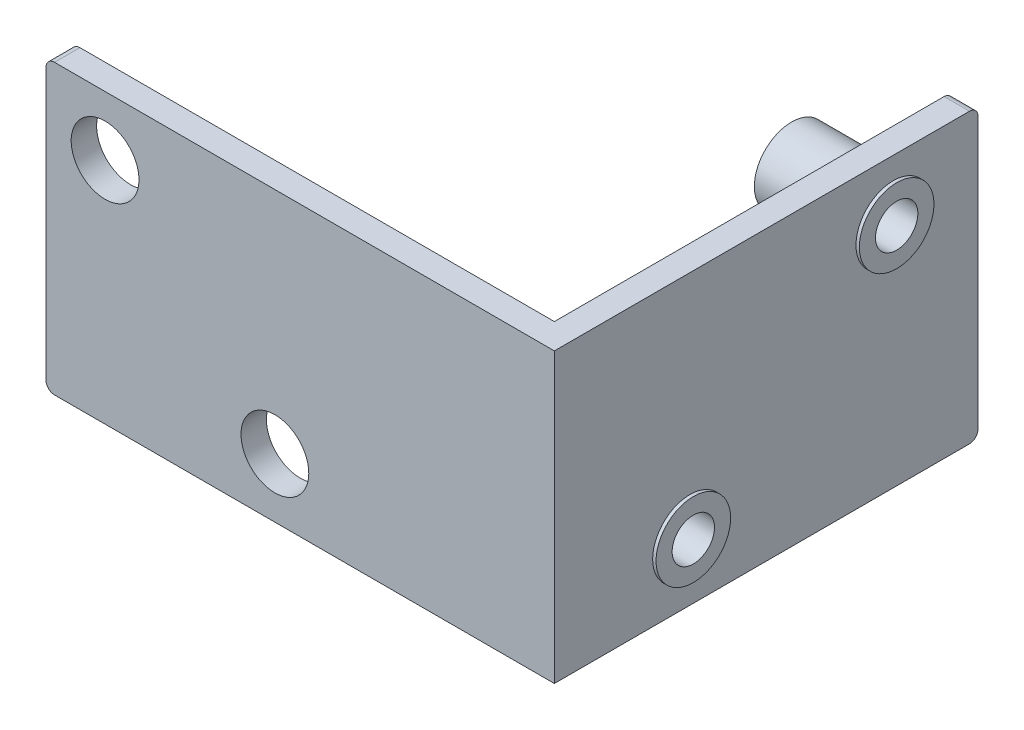
ISO-10303-21;
HEADER;
FILE_DESCRIPTION(('STEP AP214'),'2;1');
FILE_NAME('part.step','',(''),(''),'','','');
FILE_SCHEMA(('AUTOMOTIVE_DESIGN { 1 0 10303 214 1 1 1 1 }'));
ENDSEC;
DATA;
#1=APPLICATION_CONTEXT('core data for automotive mechanical design processes');
#2=APPLICATION_PROTOCOL_DEFINITION('international standard','automotive_design',2000,#1);
#3=PRODUCT_CONTEXT('',#1,'mechanical');
#4=PRODUCT('Part','Part','',(#3));
#5=PRODUCT_RELATED_PRODUCT_CATEGORY('part','',(#4));
#6=PRODUCT_DEFINITION_FORMATION('','',#4);
#7=PRODUCT_DEFINITION_CONTEXT('part definition',#1,'design');
#8=PRODUCT_DEFINITION('design','',#6,#7);
#9=PRODUCT_DEFINITION_SHAPE('','',#8);
#10=(LENGTH_UNIT() NAMED_UNIT(*) SI_UNIT(.MILLI.,.METRE.));
#11=(NAMED_UNIT(*) PLANE_ANGLE_UNIT() SI_UNIT($,.RADIAN.));
#12=(NAMED_UNIT(*) SI_UNIT($,.STERADIAN.) SOLID_ANGLE_UNIT());
#13=UNCERTAINTY_MEASURE_WITH_UNIT(LENGTH_MEASURE(1.E-05),#10,'distance_accuracy_value','');
#14=(GEOMETRIC_REPRESENTATION_CONTEXT(3) GLOBAL_UNCERTAINTY_ASSIGNED_CONTEXT((#13)) GLOBAL_UNIT_ASSIGNED_CONTEXT((#10,
#11,#12)) REPRESENTATION_CONTEXT('',''));
#15=CARTESIAN_POINT('',(0.,0.,0.));
#16=DIRECTION('',(0.,0.,1.));
#17=DIRECTION('',(1.,0.,0.));
#18=AXIS2_PLACEMENT_3D('',#15,#16,#17);
#19=CARTESIAN_POINT('',(21.0510654490106,-18.5667427701674,1.5));
#20=DIRECTION('',(-1.,0.,0.));
#21=DIRECTION('',(0.,0.,1.));
#22=AXIS2_PLACEMENT_3D('',#19,#20,#21);
#23=PLANE('',#22);
#24=CARTESIAN_POINT('',(21.0510654490106,-15.1074405858487,-6.5));
#25=DIRECTION('',(-1.,0.,0.));
#26=DIRECTION('',(0.,0.,1.));
#27=AXIS2_PLACEMENT_3D('',#24,#25,#26);
#28=CIRCLE('',#27,2.2);
#29=CARTESIAN_POINT('',(21.0510654490106,-15.1074405858487,-4.3));
#30=VERTEX_POINT('',#29);
#31=EDGE_CURVE('E157',#30,#30,#28,.F.);
#32=ORIENTED_EDGE('',*,*,#31,.F.);
#33=EDGE_LOOP('',(#32));
#34=FACE_BOUND('',#33,.T.);
#35=DIRECTION('',(0.,0.,-1.));
#36=VECTOR('',#35,1.);
#37=CARTESIAN_POINT('',(21.0510654490106,-18.5667427701674,1.5));
#38=LINE('',#37,#36);
#39=CARTESIAN_POINT('',(21.0510654490106,-18.5667427701674,1.5));
#40=VERTEX_POINT('',#39);
#41=CARTESIAN_POINT('',(21.0510654490106,-18.5667427701674,-23.));
#42=VERTEX_POINT('',#41);
#43=EDGE_CURVE('E209',#40,#42,#38,.T.);
#44=ORIENTED_EDGE('',*,*,#43,.T.);
#45=CARTESIAN_POINT('',(21.0510654490106,-18.0667427701674,-23.));
#46=DIRECTION('',(-1.,0.,0.));
#47=DIRECTION('',(0.,0.,1.));
#48=AXIS2_PLACEMENT_3D('',#45,#46,#47);
#49=CIRCLE('',#48,0.5);
#50=CARTESIAN_POINT('',(21.0510654490106,-18.0667427701674,-23.5));
#51=VERTEX_POINT('',#50);
#52=EDGE_CURVE('E186',#42,#51,#49,.F.);
#53=ORIENTED_EDGE('',*,*,#52,.T.);
#54=DIRECTION('',(0.,-1.,0.));
#55=VECTOR('',#54,1.);
#56=CARTESIAN_POINT('',(21.0510654490106,-1.56674277016742,-23.5));
#57=LINE('',#56,#55);
#58=CARTESIAN_POINT('',(21.0510654490106,-2.06674277016742,-23.5));
#59=VERTEX_POINT('',#58);
#60=EDGE_CURVE('E141',#59,#51,#57,.T.);
#61=ORIENTED_EDGE('',*,*,#60,.F.);
#62=CARTESIAN_POINT('',(21.0510654490106,-2.06674277016742,-23.));
#63=DIRECTION('',(-1.,0.,0.));
#64=DIRECTION('',(0.,0.,1.));
#65=AXIS2_PLACEMENT_3D('',#62,#63,#64);
#66=CIRCLE('',#65,0.5);
#67=CARTESIAN_POINT('',(21.0510654490106,-1.56674277016742,-23.));
#68=VERTEX_POINT('',#67);
#69=EDGE_CURVE('E184',#59,#68,#66,.F.);
#70=ORIENTED_EDGE('',*,*,#69,.T.);
#71=DIRECTION('',(0.,0.,-1.));
#72=VECTOR('',#71,1.);
#73=CARTESIAN_POINT('',(21.0510654490106,-1.56674277016742,1.5));
#74=LINE('',#73,#72);
#75=CARTESIAN_POINT('',(21.0510654490106,-1.56674277016742,1.5));
#76=VERTEX_POINT('',#75);
#77=EDGE_CURVE('E217',#76,#68,#74,.T.);
#78=ORIENTED_EDGE('',*,*,#77,.F.);
#79=DIRECTION('',(0.,1.,0.));
#80=VECTOR('',#79,1.);
#81=CARTESIAN_POINT('',(21.0510654490106,-18.5667427701674,1.5));
#82=LINE('',#81,#80);
#83=EDGE_CURVE('E211',#40,#76,#82,.T.);
#84=ORIENTED_EDGE('',*,*,#83,.F.);
#85=EDGE_LOOP('',(#44,#53,#61,#70,#78,#84));
#86=FACE_BOUND('',#85,.T.);
#87=CARTESIAN_POINT('',(21.0510654490106,-5.06674277016742,-18.5));
#88=DIRECTION('',(-1.,0.,0.));
#89=DIRECTION('',(0.,0.,1.));
#90=AXIS2_PLACEMENT_3D('',#87,#88,#89);
#91=CIRCLE('',#90,2.2);
#92=CARTESIAN_POINT('',(21.0510654490106,-5.06674277016742,-16.3));
#93=VERTEX_POINT('',#92);
#94=EDGE_CURVE('E467',#93,#93,#91,.F.);
#95=ORIENTED_EDGE('',*,*,#94,.F.);
#96=EDGE_LOOP('',(#95));
#97=FACE_BOUND('',#96,.T.);
#98=ADVANCED_FACE('F34',(#34,#86,#97),#23,.F.);
#99=CARTESIAN_POINT('',(19.5510654490106,-1.56674277016742,-23.5));
#100=DIRECTION('',(1.,0.,0.));
#101=DIRECTION('',(0.,1.,0.));
#102=AXIS2_PLACEMENT_3D('',#99,#100,#101);
#103=PLANE('',#102);
#104=CARTESIAN_POINT('',(19.5510654490106,-15.1074405858487,-6.5));
#105=DIRECTION('',(1.,0.,0.));
#106=DIRECTION('',(0.,1.,0.));
#107=AXIS2_PLACEMENT_3D('',#104,#105,#106);
#108=CIRCLE('',#107,2.2);
#109=CARTESIAN_POINT('',(19.5510654490106,-12.9074405858487,-6.5));
#110=VERTEX_POINT('',#109);
#111=EDGE_CURVE('E220',#110,#110,#108,.F.);
#112=ORIENTED_EDGE('',*,*,#111,.F.);
#113=EDGE_LOOP('',(#112));
#114=FACE_BOUND('',#113,.T.);
#115=DIRECTION('',(0.,1.,0.));
#116=VECTOR('',#115,1.);
#117=CARTESIAN_POINT('',(19.5510654490106,-1.56674277016742,-23.5));
#118=LINE('',#117,#116);
#119=CARTESIAN_POINT('',(19.5510654490106,-18.0667427701674,-23.5));
#120=VERTEX_POINT('',#119);
#121=CARTESIAN_POINT('',(19.5510654490106,-2.06674277016742,-23.5));
#122=VERTEX_POINT('',#121);
#123=EDGE_CURVE('E123',#120,#122,#118,.T.);
#124=ORIENTED_EDGE('',*,*,#123,.F.);
#125=CARTESIAN_POINT('',(19.5510654490106,-18.0667427701674,-23.));
#126=DIRECTION('',(1.,0.,0.));
#127=DIRECTION('',(0.,1.,0.));
#128=AXIS2_PLACEMENT_3D('',#125,#126,#127);
#129=CIRCLE('',#128,0.5);
#130=CARTESIAN_POINT('',(19.5510654490106,-18.5667427701674,-23.));
#131=VERTEX_POINT('',#130);
#132=EDGE_CURVE('E177',#120,#131,#129,.F.);
#133=ORIENTED_EDGE('',*,*,#132,.T.);
#134=DIRECTION('',(0.,0.,1.));
#135=VECTOR('',#134,1.);
#136=CARTESIAN_POINT('',(19.5510654490106,-18.5667427701674,-23.5));
#137=LINE('',#136,#135);
#138=CARTESIAN_POINT('',(19.5510654490106,-18.5667427701674,0.));
#139=VERTEX_POINT('',#138);
#140=EDGE_CURVE('E122',#131,#139,#137,.T.);
#141=ORIENTED_EDGE('',*,*,#140,.T.);
#142=DIRECTION('',(0.,1.,0.));
#143=VECTOR('',#142,1.);
#144=CARTESIAN_POINT('',(19.5510654490106,-1.56674277016742,0.));
#145=LINE('',#144,#143);
#146=CARTESIAN_POINT('',(19.5510654490106,-1.56674277016742,0.));
#147=VERTEX_POINT('',#146);
#148=EDGE_CURVE('E130',#139,#147,#145,.T.);
#149=ORIENTED_EDGE('',*,*,#148,.T.);
#150=DIRECTION('',(0.,0.,1.));
#151=VECTOR('',#150,1.);
#152=CARTESIAN_POINT('',(19.5510654490106,-1.56674277016742,-23.5));
#153=LINE('',#152,#151);
#154=CARTESIAN_POINT('',(19.5510654490106,-1.56674277016742,-23.));
#155=VERTEX_POINT('',#154);
#156=EDGE_CURVE('E111',#155,#147,#153,.T.);
#157=ORIENTED_EDGE('',*,*,#156,.F.);
#158=CARTESIAN_POINT('',(19.5510654490106,-2.06674277016742,-23.));
#159=DIRECTION('',(1.,0.,0.));
#160=DIRECTION('',(0.,1.,0.));
#161=AXIS2_PLACEMENT_3D('',#158,#159,#160);
#162=CIRCLE('',#161,0.5);
#163=EDGE_CURVE('E454',#155,#122,#162,.F.);
#164=ORIENTED_EDGE('',*,*,#163,.T.);
#165=EDGE_LOOP('',(#124,#133,#141,#149,#157,#164));
#166=FACE_BOUND('',#165,.T.);
#167=CARTESIAN_POINT('',(19.5510654490106,-5.06674277016742,-18.5));
#168=DIRECTION('',(1.,0.,0.));
#169=DIRECTION('',(0.,1.,0.));
#170=AXIS2_PLACEMENT_3D('',#167,#168,#169);
#171=CIRCLE('',#170,2.2);
#172=CARTESIAN_POINT('',(19.5510654490106,-2.86674277016742,-18.5));
#173=VERTEX_POINT('',#172);
#174=EDGE_CURVE('E464',#173,#173,#171,.F.);
#175=ORIENTED_EDGE('',*,*,#174,.F.);
#176=EDGE_LOOP('',(#175));
#177=FACE_BOUND('',#176,.T.);
#178=ADVANCED_FACE('F138',(#114,#166,#177),#103,.F.);
#179=CARTESIAN_POINT('',(-8.94893455098936,-18.5667427701674,1.5));
#180=DIRECTION('',(1.,0.,0.));
#181=DIRECTION('',(0.,0.,-1.));
#182=AXIS2_PLACEMENT_3D('',#179,#180,#181);
#183=PLANE('',#182);
#184=DIRECTION('',(0.,-1.,0.));
#185=VECTOR('',#184,1.);
#186=CARTESIAN_POINT('',(-8.94893455098936,-18.5667427701674,0.));
#187=LINE('',#186,#185);
#188=CARTESIAN_POINT('',(-8.94893455098936,-2.06674277016742,0.));
#189=VERTEX_POINT('',#188);
#190=CARTESIAN_POINT('',(-8.94893455098936,-18.0667427701674,0.));
#191=VERTEX_POINT('',#190);
#192=EDGE_CURVE('E169',#189,#191,#187,.T.);
#193=ORIENTED_EDGE('',*,*,#192,.T.);
#194=DIRECTION('',(0.,0.,-1.));
#195=VECTOR('',#194,1.);
#196=CARTESIAN_POINT('',(-8.94893455098936,-18.0667427701674,1.5));
#197=LINE('',#196,#195);
#198=CARTESIAN_POINT('',(-8.94893455098936,-18.0667427701674,1.5));
#199=VERTEX_POINT('',#198);
#200=EDGE_CURVE('E49',#191,#199,#197,.F.);
#201=ORIENTED_EDGE('',*,*,#200,.T.);
#202=DIRECTION('',(0.,-1.,0.));
#203=VECTOR('',#202,1.);
#204=CARTESIAN_POINT('',(-8.94893455098936,-18.5667427701674,1.5));
#205=LINE('',#204,#203);
#206=CARTESIAN_POINT('',(-8.94893455098936,-2.06674277016742,1.5));
#207=VERTEX_POINT('',#206);
#208=EDGE_CURVE('E133',#207,#199,#205,.T.);
#209=ORIENTED_EDGE('',*,*,#208,.F.);
#210=DIRECTION('',(0.,0.,-1.));
#211=VECTOR('',#210,1.);
#212=CARTESIAN_POINT('',(-8.94893455098936,-2.06674277016742,1.5));
#213=LINE('',#212,#211);
#214=EDGE_CURVE('E194',#207,#189,#213,.T.);
#215=ORIENTED_EDGE('',*,*,#214,.T.);
#216=EDGE_LOOP('',(#193,#201,#209,#215));
#217=FACE_BOUND('',#216,.T.);
#218=ADVANCED_FACE('F36',(#217),#183,.F.);
#219=CARTESIAN_POINT('',(-8.94893455098936,-18.5667427701674,1.5));
#220=DIRECTION('',(0.,1.,0.));
#221=DIRECTION('',(0.,0.,1.));
#222=AXIS2_PLACEMENT_3D('',#219,#220,#221);
#223=PLANE('',#222);
#224=ORIENTED_EDGE('',*,*,#140,.F.);
#225=DIRECTION('',(-1.,0.,0.));
#226=VECTOR('',#225,1.);
#227=CARTESIAN_POINT('',(21.0510654490106,-18.5667427701674,-23.));
#228=LINE('',#227,#226);
#229=EDGE_CURVE('E182',#131,#42,#228,.F.);
#230=ORIENTED_EDGE('',*,*,#229,.T.);
#231=ORIENTED_EDGE('',*,*,#43,.F.);
#232=DIRECTION('',(1.,0.,0.));
#233=VECTOR('',#232,1.);
#234=CARTESIAN_POINT('',(-8.94893455098936,-18.5667427701674,1.5));
#235=LINE('',#234,#233);
#236=CARTESIAN_POINT('',(-8.44893455098936,-18.5667427701674,1.5));
#237=VERTEX_POINT('',#236);
#238=EDGE_CURVE('E207',#237,#40,#235,.T.);
#239=ORIENTED_EDGE('',*,*,#238,.F.);
#240=DIRECTION('',(0.,0.,-1.));
#241=VECTOR('',#240,1.);
#242=CARTESIAN_POINT('',(-8.44893455098936,-18.5667427701674,1.5));
#243=LINE('',#242,#241);
#244=CARTESIAN_POINT('',(-8.44893455098936,-18.5667427701674,0.));
#245=VERTEX_POINT('',#244);
#246=EDGE_CURVE('E179',#237,#245,#243,.T.);
#247=ORIENTED_EDGE('',*,*,#246,.T.);
#248=DIRECTION('',(1.,0.,0.));
#249=VECTOR('',#248,1.);
#250=CARTESIAN_POINT('',(-8.94893455098936,-18.5667427701674,0.));
#251=LINE('',#250,#249);
#252=EDGE_CURVE('E134',#245,#139,#251,.T.);
#253=ORIENTED_EDGE('',*,*,#252,.T.);
#254=EDGE_LOOP('',(#224,#230,#231,#239,#247,#253));
#255=FACE_BOUND('',#254,.T.);
#256=ADVANCED_FACE('F205',(#255),#223,.F.);
#257=CARTESIAN_POINT('',(-8.94893455098936,-1.56674277016742,1.5));
#258=DIRECTION('',(0.,-1.,0.));
#259=DIRECTION('',(0.,0.,-1.));
#260=AXIS2_PLACEMENT_3D('',#257,#258,#259);
#261=PLANE('',#260);
#262=ORIENTED_EDGE('',*,*,#77,.T.);
#263=DIRECTION('',(1.,0.,0.));
#264=VECTOR('',#263,1.);
#265=CARTESIAN_POINT('',(19.5510654490106,-1.56674277016742,-23.));
#266=LINE('',#265,#264);
#267=EDGE_CURVE('E118',#68,#155,#266,.F.);
#268=ORIENTED_EDGE('',*,*,#267,.T.);
#269=ORIENTED_EDGE('',*,*,#156,.T.);
#270=DIRECTION('',(-1.,0.,0.));
#271=VECTOR('',#270,1.);
#272=CARTESIAN_POINT('',(-8.94893455098936,-1.56674277016742,0.));
#273=LINE('',#272,#271);
#274=CARTESIAN_POINT('',(-8.44893455098936,-1.56674277016742,0.));
#275=VERTEX_POINT('',#274);
#276=EDGE_CURVE('E115',#147,#275,#273,.T.);
#277=ORIENTED_EDGE('',*,*,#276,.T.);
#278=DIRECTION('',(0.,0.,-1.));
#279=VECTOR('',#278,1.);
#280=CARTESIAN_POINT('',(-8.44893455098936,-1.56674277016742,1.5));
#281=LINE('',#280,#279);
#282=CARTESIAN_POINT('',(-8.44893455098936,-1.56674277016742,1.5));
#283=VERTEX_POINT('',#282);
#284=EDGE_CURVE('E188',#275,#283,#281,.F.);
#285=ORIENTED_EDGE('',*,*,#284,.T.);
#286=DIRECTION('',(-1.,0.,0.));
#287=VECTOR('',#286,1.);
#288=CARTESIAN_POINT('',(-8.94893455098936,-1.56674277016742,1.5));
#289=LINE('',#288,#287);
#290=EDGE_CURVE('E213',#76,#283,#289,.T.);
#291=ORIENTED_EDGE('',*,*,#290,.F.);
#292=EDGE_LOOP('',(#262,#268,#269,#277,#285,#291));
#293=FACE_BOUND('',#292,.T.);
#294=ADVANCED_FACE('F114',(#293),#261,.F.);
#295=CARTESIAN_POINT('',(-8.94893455098936,-1.56674277016742,1.5));
#296=DIRECTION('',(0.,0.,-1.));
#297=DIRECTION('',(-1.,0.,0.));
#298=AXIS2_PLACEMENT_3D('',#295,#296,#297);
#299=PLANE('',#298);
#300=CARTESIAN_POINT('',(4.55843129394918,-15.0700643297165,1.5));
#301=DIRECTION('',(0.,0.,1.));
#302=DIRECTION('',(1.,0.,0.));
#303=AXIS2_PLACEMENT_3D('',#300,#301,#302);
#304=CIRCLE('',#303,2.);
#305=CARTESIAN_POINT('',(6.55843129394918,-15.0700643297165,1.5));
#306=VERTEX_POINT('',#305);
#307=EDGE_CURVE('E161',#306,#306,#304,.T.);
#308=ORIENTED_EDGE('',*,*,#307,.F.);
#309=EDGE_LOOP('',(#308));
#310=FACE_BOUND('',#309,.T.);
#311=CARTESIAN_POINT('',(-5.46307738156506,-5.07616311611827,1.5));
#312=DIRECTION('',(0.,0.,1.));
#313=DIRECTION('',(1.,0.,0.));
#314=AXIS2_PLACEMENT_3D('',#311,#312,#313);
#315=CIRCLE('',#314,2.);
#316=CARTESIAN_POINT('',(-3.46307738156506,-5.07616311611827,1.5));
#317=VERTEX_POINT('',#316);
#318=EDGE_CURVE('E165',#317,#317,#315,.T.);
#319=ORIENTED_EDGE('',*,*,#318,.F.);
#320=EDGE_LOOP('',(#319));
#321=FACE_BOUND('',#320,.T.);
#322=ORIENTED_EDGE('',*,*,#208,.T.);
#323=CARTESIAN_POINT('',(-8.44893455098936,-18.0667427701674,1.5));
#324=DIRECTION('',(0.,0.,-1.));
#325=DIRECTION('',(-1.,0.,0.));
#326=AXIS2_PLACEMENT_3D('',#323,#324,#325);
#327=CIRCLE('',#326,0.5);
#328=EDGE_CURVE('E11',#199,#237,#327,.F.);
#329=ORIENTED_EDGE('',*,*,#328,.T.);
#330=ORIENTED_EDGE('',*,*,#238,.T.);
#331=ORIENTED_EDGE('',*,*,#83,.T.);
#332=ORIENTED_EDGE('',*,*,#290,.T.);
#333=CARTESIAN_POINT('',(-8.44893455098936,-2.06674277016742,1.5));
#334=DIRECTION('',(0.,0.,-1.));
#335=DIRECTION('',(-1.,0.,0.));
#336=AXIS2_PLACEMENT_3D('',#333,#334,#335);
#337=CIRCLE('',#336,0.5);
#338=EDGE_CURVE('E42',#283,#207,#337,.F.);
#339=ORIENTED_EDGE('',*,*,#338,.T.);
#340=EDGE_LOOP('',(#322,#329,#330,#331,#332,#339));
#341=FACE_BOUND('',#340,.T.);
#342=ADVANCED_FACE('F230',(#310,#321,#341),#299,.F.);
#343=CARTESIAN_POINT('',(-8.94893455098936,-1.56674277016742,0.));
#344=DIRECTION('',(0.,0.,-1.));
#345=DIRECTION('',(-1.,0.,0.));
#346=AXIS2_PLACEMENT_3D('',#343,#344,#345);
#347=PLANE('',#346);
#348=ORIENTED_EDGE('',*,*,#252,.F.);
#349=CARTESIAN_POINT('',(-8.44893455098936,-18.0667427701674,0.));
#350=DIRECTION('',(0.,0.,-1.));
#351=DIRECTION('',(-1.,0.,0.));
#352=AXIS2_PLACEMENT_3D('',#349,#350,#351);
#353=CIRCLE('',#352,0.5);
#354=EDGE_CURVE('E192',#245,#191,#353,.T.);
#355=ORIENTED_EDGE('',*,*,#354,.T.);
#356=ORIENTED_EDGE('',*,*,#192,.F.);
#357=CARTESIAN_POINT('',(-8.44893455098936,-2.06674277016742,0.));
#358=DIRECTION('',(0.,0.,-1.));
#359=DIRECTION('',(-1.,0.,0.));
#360=AXIS2_PLACEMENT_3D('',#357,#358,#359);
#361=CIRCLE('',#360,0.5);
#362=EDGE_CURVE('E132',#189,#275,#361,.T.);
#363=ORIENTED_EDGE('',*,*,#362,.T.);
#364=ORIENTED_EDGE('',*,*,#276,.F.);
#365=ORIENTED_EDGE('',*,*,#148,.F.);
#366=EDGE_LOOP('',(#348,#355,#356,#363,#364,#365));
#367=FACE_BOUND('',#366,.T.);
#368=CARTESIAN_POINT('',(4.55843129394918,-15.0700643297165,0.));
#369=DIRECTION('',(0.,0.,-1.));
#370=DIRECTION('',(-1.,0.,0.));
#371=AXIS2_PLACEMENT_3D('',#368,#369,#370);
#372=CIRCLE('',#371,2.);
#373=CARTESIAN_POINT('',(2.55843129394918,-15.0700643297165,0.));
#374=VERTEX_POINT('',#373);
#375=EDGE_CURVE('E164',#374,#374,#372,.T.);
#376=ORIENTED_EDGE('',*,*,#375,.F.);
#377=EDGE_LOOP('',(#376));
#378=FACE_BOUND('',#377,.T.);
#379=CARTESIAN_POINT('',(-5.46307738156506,-5.07616311611827,0.));
#380=DIRECTION('',(0.,0.,-1.));
#381=DIRECTION('',(-1.,0.,0.));
#382=AXIS2_PLACEMENT_3D('',#379,#380,#381);
#383=CIRCLE('',#382,2.);
#384=CARTESIAN_POINT('',(-7.46307738156506,-5.07616311611827,0.));
#385=VERTEX_POINT('',#384);
#386=EDGE_CURVE('E168',#385,#385,#383,.T.);
#387=ORIENTED_EDGE('',*,*,#386,.F.);
#388=EDGE_LOOP('',(#387));
#389=FACE_BOUND('',#388,.T.);
#390=ADVANCED_FACE('F128',(#367,#378,#389),#347,.T.);
#391=CARTESIAN_POINT('',(-5.46307738156506,-5.07616311611827,-0.5));
#392=DIRECTION('',(0.,0.,1.));
#393=DIRECTION('',(1.,0.,0.));
#394=AXIS2_PLACEMENT_3D('',#391,#392,#393);
#395=CYLINDRICAL_SURFACE('',#394,2.);
#396=ORIENTED_EDGE('',*,*,#386,.T.);
#397=EDGE_LOOP('',(#396));
#398=FACE_BOUND('',#397,.T.);
#399=ORIENTED_EDGE('',*,*,#318,.T.);
#400=EDGE_LOOP('',(#399));
#401=FACE_BOUND('',#400,.T.);
#402=ADVANCED_FACE('F229',(#398,#401),#395,.F.);
#403=CARTESIAN_POINT('',(4.55843129394918,-15.0700643297165,-0.5));
#404=DIRECTION('',(0.,0.,1.));
#405=DIRECTION('',(1.,0.,0.));
#406=AXIS2_PLACEMENT_3D('',#403,#404,#405);
#407=CYLINDRICAL_SURFACE('',#406,2.);
#408=ORIENTED_EDGE('',*,*,#375,.T.);
#409=EDGE_LOOP('',(#408));
#410=FACE_BOUND('',#409,.T.);
#411=ORIENTED_EDGE('',*,*,#307,.T.);
#412=EDGE_LOOP('',(#411));
#413=FACE_BOUND('',#412,.T.);
#414=ADVANCED_FACE('F225',(#410,#413),#407,.F.);
#415=CARTESIAN_POINT('',(21.0510654490106,-18.5667427701674,-23.5));
#416=DIRECTION('',(0.,0.,-1.));
#417=DIRECTION('',(-1.,0.,0.));
#418=AXIS2_PLACEMENT_3D('',#415,#416,#417);
#419=PLANE('',#418);
#420=ORIENTED_EDGE('',*,*,#60,.T.);
#421=DIRECTION('',(-1.,0.,0.));
#422=VECTOR('',#421,1.);
#423=CARTESIAN_POINT('',(19.5510654490106,-18.0667427701674,-23.5));
#424=LINE('',#423,#422);
#425=EDGE_CURVE('E456',#51,#120,#424,.T.);
#426=ORIENTED_EDGE('',*,*,#425,.T.);
#427=ORIENTED_EDGE('',*,*,#123,.T.);
#428=DIRECTION('',(1.,0.,0.));
#429=VECTOR('',#428,1.);
#430=CARTESIAN_POINT('',(21.0510654490106,-2.06674277016742,-23.5));
#431=LINE('',#430,#429);
#432=EDGE_CURVE('E455',#122,#59,#431,.T.);
#433=ORIENTED_EDGE('',*,*,#432,.T.);
#434=EDGE_LOOP('',(#420,#426,#427,#433));
#435=FACE_BOUND('',#434,.T.);
#436=ADVANCED_FACE('F376',(#435),#419,.T.);
#437=CARTESIAN_POINT('',(21.2510654490106,-15.1074405858487,-6.5));
#438=DIRECTION('',(-1.,0.,0.));
#439=DIRECTION('',(0.,0.,1.));
#440=AXIS2_PLACEMENT_3D('',#437,#438,#439);
#441=CYLINDRICAL_SURFACE('',#440,2.2);
#442=CARTESIAN_POINT('',(15.0510654490106,-15.1074405858487,-6.5));
#443=DIRECTION('',(1.,0.,0.));
#444=DIRECTION('',(0.,0.,-1.));
#445=AXIS2_PLACEMENT_3D('',#442,#443,#444);
#446=CIRCLE('',#445,2.2);
#447=CARTESIAN_POINT('',(15.0510654490106,-15.1074405858487,-8.7));
#448=VERTEX_POINT('',#447);
#449=EDGE_CURVE('E479',#448,#448,#446,.T.);
#450=ORIENTED_EDGE('',*,*,#449,.T.);
#451=EDGE_LOOP('',(#450));
#452=FACE_BOUND('',#451,.T.);
#453=ORIENTED_EDGE('',*,*,#111,.T.);
#454=EDGE_LOOP('',(#453));
#455=FACE_BOUND('',#454,.T.);
#456=ADVANCED_FACE('F349',(#452,#455),#441,.T.);
#457=CARTESIAN_POINT('',(15.0510654490106,-15.1074405858487,-6.5));
#458=DIRECTION('',(1.,0.,0.));
#459=DIRECTION('',(0.,0.,-1.));
#460=AXIS2_PLACEMENT_3D('',#457,#458,#459);
#461=PLANE('',#460);
#462=CARTESIAN_POINT('',(15.0510654490106,-15.1074405858487,-6.5));
#463=DIRECTION('',(1.,0.,0.));
#464=DIRECTION('',(0.,0.,-1.));
#465=AXIS2_PLACEMENT_3D('',#462,#463,#464);
#466=CIRCLE('',#465,1.25);
#467=CARTESIAN_POINT('',(15.0510654490106,-15.1074405858487,-7.75));
#468=VERTEX_POINT('',#467);
#469=EDGE_CURVE('E476',#468,#468,#466,.T.);
#470=ORIENTED_EDGE('',*,*,#469,.T.);
#471=EDGE_LOOP('',(#470));
#472=FACE_BOUND('',#471,.T.);
#473=ORIENTED_EDGE('',*,*,#449,.F.);
#474=EDGE_LOOP('',(#473));
#475=FACE_BOUND('',#474,.T.);
#476=ADVANCED_FACE('F357',(#472,#475),#461,.F.);
#477=CARTESIAN_POINT('',(19.0510654490106,-15.1074405858487,-6.5));
#478=DIRECTION('',(1.,0.,0.));
#479=DIRECTION('',(0.,0.,-1.));
#480=AXIS2_PLACEMENT_3D('',#477,#478,#479);
#481=CYLINDRICAL_SURFACE('',#480,1.25);
#482=ORIENTED_EDGE('',*,*,#469,.F.);
#483=EDGE_LOOP('',(#482));
#484=FACE_BOUND('',#483,.T.);
#485=CARTESIAN_POINT('',(21.2510654490106,-15.1074405858487,-6.5));
#486=DIRECTION('',(1.,0.,0.));
#487=DIRECTION('',(0.,0.,-1.));
#488=AXIS2_PLACEMENT_3D('',#485,#486,#487);
#489=CIRCLE('',#488,1.25);
#490=CARTESIAN_POINT('',(21.2510654490106,-15.1074405858487,-7.75));
#491=VERTEX_POINT('',#490);
#492=EDGE_CURVE('E147',#491,#491,#489,.T.);
#493=ORIENTED_EDGE('',*,*,#492,.T.);
#494=EDGE_LOOP('',(#493));
#495=FACE_BOUND('',#494,.T.);
#496=ADVANCED_FACE('F346',(#484,#495),#481,.F.);
#497=CARTESIAN_POINT('',(21.2510654490106,-15.1074405858487,-6.5));
#498=DIRECTION('',(1.,0.,0.));
#499=DIRECTION('',(0.,0.,-1.));
#500=AXIS2_PLACEMENT_3D('',#497,#498,#499);
#501=CIRCLE('',#500,2.2);
#502=CARTESIAN_POINT('',(21.2510654490106,-15.1074405858487,-8.7));
#503=VERTEX_POINT('',#502);
#504=EDGE_CURVE('E142',#503,#503,#501,.T.);
#505=ORIENTED_EDGE('',*,*,#504,.F.);
#506=EDGE_LOOP('',(#505));
#507=FACE_BOUND('',#506,.T.);
#508=ORIENTED_EDGE('',*,*,#31,.T.);
#509=EDGE_LOOP('',(#508));
#510=FACE_BOUND('',#509,.T.);
#511=ADVANCED_FACE('F336',(#507,#510),#441,.T.);
#512=CARTESIAN_POINT('',(21.2510654490106,-15.1074405858487,-6.5));
#513=DIRECTION('',(1.,0.,0.));
#514=DIRECTION('',(0.,0.,-1.));
#515=AXIS2_PLACEMENT_3D('',#512,#513,#514);
#516=PLANE('',#515);
#517=ORIENTED_EDGE('',*,*,#504,.T.);
#518=EDGE_LOOP('',(#517));
#519=FACE_BOUND('',#518,.T.);
#520=ORIENTED_EDGE('',*,*,#492,.F.);
#521=EDGE_LOOP('',(#520));
#522=FACE_BOUND('',#521,.T.);
#523=ADVANCED_FACE('F327',(#519,#522),#516,.T.);
#524=CARTESIAN_POINT('',(21.2510654490106,-5.06674277016742,-18.5));
#525=DIRECTION('',(-1.,0.,0.));
#526=DIRECTION('',(0.,0.,1.));
#527=AXIS2_PLACEMENT_3D('',#524,#525,#526);
#528=CYLINDRICAL_SURFACE('',#527,2.2);
#529=CARTESIAN_POINT('',(15.0510654490106,-5.06674277016742,-18.5));
#530=DIRECTION('',(1.,0.,0.));
#531=DIRECTION('',(0.,0.,-1.));
#532=AXIS2_PLACEMENT_3D('',#529,#530,#531);
#533=CIRCLE('',#532,2.2);
#534=CARTESIAN_POINT('',(15.0510654490106,-5.06674277016742,-20.7));
#535=VERTEX_POINT('',#534);
#536=EDGE_CURVE('E495',#535,#535,#533,.T.);
#537=ORIENTED_EDGE('',*,*,#536,.T.);
#538=EDGE_LOOP('',(#537));
#539=FACE_BOUND('',#538,.T.);
#540=ORIENTED_EDGE('',*,*,#174,.T.);
#541=EDGE_LOOP('',(#540));
#542=FACE_BOUND('',#541,.T.);
#543=ADVANCED_FACE('F300',(#539,#542),#528,.T.);
#544=CARTESIAN_POINT('',(15.0510654490106,-5.06674277016742,-18.5));
#545=DIRECTION('',(1.,0.,0.));
#546=DIRECTION('',(0.,0.,-1.));
#547=AXIS2_PLACEMENT_3D('',#544,#545,#546);
#548=PLANE('',#547);
#549=CARTESIAN_POINT('',(15.0510654490106,-5.06674277016742,-18.5));
#550=DIRECTION('',(1.,0.,0.));
#551=DIRECTION('',(0.,0.,-1.));
#552=AXIS2_PLACEMENT_3D('',#549,#550,#551);
#553=CIRCLE('',#552,1.25);
#554=CARTESIAN_POINT('',(15.0510654490106,-5.06674277016742,-19.75));
#555=VERTEX_POINT('',#554);
#556=EDGE_CURVE('E499',#555,#555,#553,.T.);
#557=ORIENTED_EDGE('',*,*,#556,.T.);
#558=EDGE_LOOP('',(#557));
#559=FACE_BOUND('',#558,.T.);
#560=ORIENTED_EDGE('',*,*,#536,.F.);
#561=EDGE_LOOP('',(#560));
#562=FACE_BOUND('',#561,.T.);
#563=ADVANCED_FACE('F308',(#559,#562),#548,.F.);
#564=CARTESIAN_POINT('',(19.0510654490106,-5.06674277016742,-18.5));
#565=DIRECTION('',(1.,0.,0.));
#566=DIRECTION('',(0.,0.,-1.));
#567=AXIS2_PLACEMENT_3D('',#564,#565,#566);
#568=CYLINDRICAL_SURFACE('',#567,1.25);
#569=ORIENTED_EDGE('',*,*,#556,.F.);
#570=EDGE_LOOP('',(#569));
#571=FACE_BOUND('',#570,.T.);
#572=CARTESIAN_POINT('',(21.2510654490106,-5.06674277016742,-18.5));
#573=DIRECTION('',(1.,0.,0.));
#574=DIRECTION('',(0.,0.,-1.));
#575=AXIS2_PLACEMENT_3D('',#572,#573,#574);
#576=CIRCLE('',#575,1.25);
#577=CARTESIAN_POINT('',(21.2510654490106,-5.06674277016742,-19.75));
#578=VERTEX_POINT('',#577);
#579=EDGE_CURVE('E492',#578,#578,#576,.T.);
#580=ORIENTED_EDGE('',*,*,#579,.T.);
#581=EDGE_LOOP('',(#580));
#582=FACE_BOUND('',#581,.T.);
#583=ADVANCED_FACE('F297',(#571,#582),#568,.F.);
#584=CARTESIAN_POINT('',(21.2510654490106,-5.06674277016742,-18.5));
#585=DIRECTION('',(1.,0.,0.));
#586=DIRECTION('',(0.,0.,-1.));
#587=AXIS2_PLACEMENT_3D('',#584,#585,#586);
#588=CIRCLE('',#587,2.2);
#589=CARTESIAN_POINT('',(21.2510654490106,-5.06674277016742,-20.7));
#590=VERTEX_POINT('',#589);
#591=EDGE_CURVE('E474',#590,#590,#588,.T.);
#592=ORIENTED_EDGE('',*,*,#591,.F.);
#593=EDGE_LOOP('',(#592));
#594=FACE_BOUND('',#593,.T.);
#595=ORIENTED_EDGE('',*,*,#94,.T.);
#596=EDGE_LOOP('',(#595));
#597=FACE_BOUND('',#596,.T.);
#598=ADVANCED_FACE('F285',(#594,#597),#528,.T.);
#599=CARTESIAN_POINT('',(21.2510654490106,-5.06674277016742,-18.5));
#600=DIRECTION('',(1.,0.,0.));
#601=DIRECTION('',(0.,0.,-1.));
#602=AXIS2_PLACEMENT_3D('',#599,#600,#601);
#603=PLANE('',#602);
#604=ORIENTED_EDGE('',*,*,#591,.T.);
#605=EDGE_LOOP('',(#604));
#606=FACE_BOUND('',#605,.T.);
#607=ORIENTED_EDGE('',*,*,#579,.F.);
#608=EDGE_LOOP('',(#607));
#609=FACE_BOUND('',#608,.T.);
#610=ADVANCED_FACE('F279',(#606,#609),#603,.T.);
#611=CARTESIAN_POINT('',(21.0510654490106,-18.0667427701674,-23.));
#612=DIRECTION('',(1.,0.,0.));
#613=DIRECTION('',(0.,0.,-1.));
#614=AXIS2_PLACEMENT_3D('',#611,#612,#613);
#615=CYLINDRICAL_SURFACE('',#614,0.5);
#616=ORIENTED_EDGE('',*,*,#52,.F.);
#617=ORIENTED_EDGE('',*,*,#229,.F.);
#618=ORIENTED_EDGE('',*,*,#132,.F.);
#619=ORIENTED_EDGE('',*,*,#425,.F.);
#620=EDGE_LOOP('',(#616,#617,#618,#619));
#621=FACE_BOUND('',#620,.T.);
#622=ADVANCED_FACE('F284',(#621),#615,.T.);
#623=CARTESIAN_POINT('',(21.0510654490106,-2.06674277016742,-23.));
#624=DIRECTION('',(-1.,0.,0.));
#625=DIRECTION('',(0.,0.,1.));
#626=AXIS2_PLACEMENT_3D('',#623,#624,#625);
#627=CYLINDRICAL_SURFACE('',#626,0.5);
#628=ORIENTED_EDGE('',*,*,#163,.F.);
#629=ORIENTED_EDGE('',*,*,#267,.F.);
#630=ORIENTED_EDGE('',*,*,#69,.F.);
#631=ORIENTED_EDGE('',*,*,#432,.F.);
#632=EDGE_LOOP('',(#628,#629,#630,#631));
#633=FACE_BOUND('',#632,.T.);
#634=ADVANCED_FACE('F417',(#633),#627,.T.);
#635=CARTESIAN_POINT('',(-8.44893455098936,-18.0667427701674,1.5));
#636=DIRECTION('',(0.,0.,-1.));
#637=DIRECTION('',(-1.,0.,0.));
#638=AXIS2_PLACEMENT_3D('',#635,#636,#637);
#639=CYLINDRICAL_SURFACE('',#638,0.5);
#640=ORIENTED_EDGE('',*,*,#328,.F.);
#641=ORIENTED_EDGE('',*,*,#200,.F.);
#642=ORIENTED_EDGE('',*,*,#354,.F.);
#643=ORIENTED_EDGE('',*,*,#246,.F.);
#644=EDGE_LOOP('',(#640,#641,#642,#643));
#645=FACE_BOUND('',#644,.T.);
#646=ADVANCED_FACE('F202',(#645),#639,.T.);
#647=CARTESIAN_POINT('',(-8.44893455098936,-2.06674277016742,1.5));
#648=DIRECTION('',(0.,0.,-1.));
#649=DIRECTION('',(-1.,0.,0.));
#650=AXIS2_PLACEMENT_3D('',#647,#648,#649);
#651=CYLINDRICAL_SURFACE('',#650,0.5);
#652=ORIENTED_EDGE('',*,*,#338,.F.);
#653=ORIENTED_EDGE('',*,*,#284,.F.);
#654=ORIENTED_EDGE('',*,*,#362,.F.);
#655=ORIENTED_EDGE('',*,*,#214,.F.);
#656=EDGE_LOOP('',(#652,#653,#654,#655));
#657=FACE_BOUND('',#656,.T.);
#658=ADVANCED_FACE('F436',(#657),#651,.T.);
#659=CLOSED_SHELL('',(#98,#178,#218,#256,#294,#342,#390,#402,#414,#436,#456,#476,#496,#511,#523,
#543,#563,#583,#598,#610,#622,#634,#646,#658));
#660=MANIFOLD_SOLID_BREP('B2',#659);
#661=ADVANCED_BREP_SHAPE_REPRESENTATION('',(#18,#660),#14);
#662=SHAPE_DEFINITION_REPRESENTATION(#9,#661);
ENDSEC;
END-ISO-10303-21;
